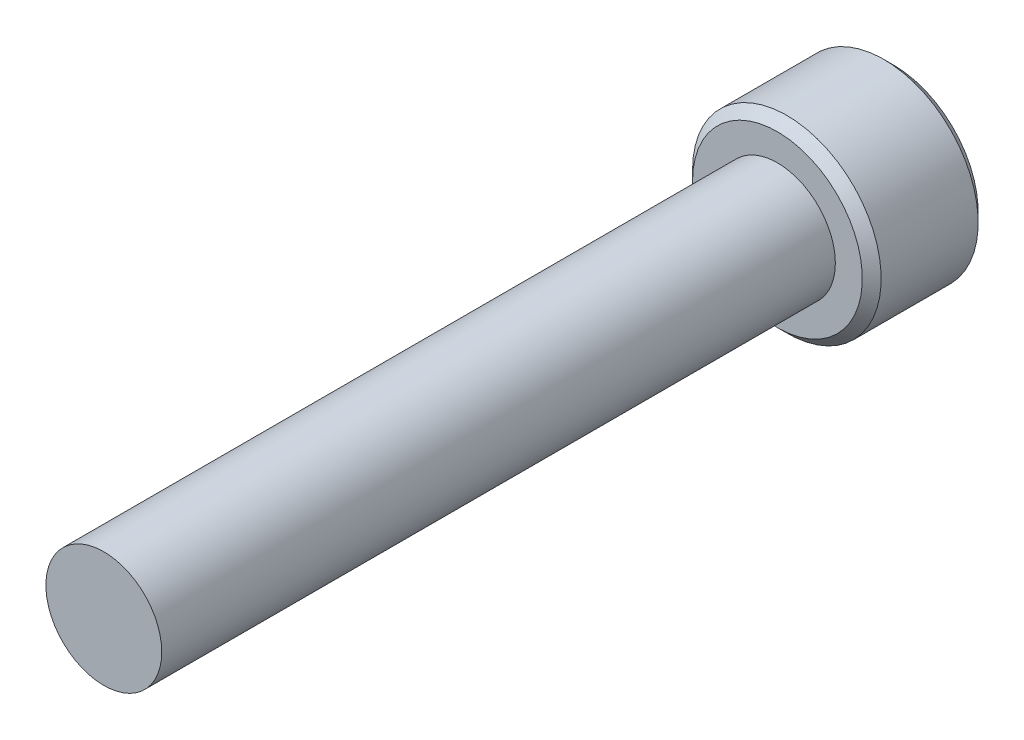
ISO-10303-21;
HEADER;
FILE_DESCRIPTION(('STEP AP214'),'2;1');
FILE_NAME('part.step','',(''),(''),'','','');
FILE_SCHEMA(('AUTOMOTIVE_DESIGN { 1 0 10303 214 1 1 1 1 }'));
ENDSEC;
DATA;
#1=APPLICATION_CONTEXT('core data for automotive mechanical design processes');
#2=APPLICATION_PROTOCOL_DEFINITION('international standard','automotive_design',2000,#1);
#3=PRODUCT_CONTEXT('',#1,'mechanical');
#4=PRODUCT('Part','Part','',(#3));
#5=PRODUCT_RELATED_PRODUCT_CATEGORY('part','',(#4));
#6=PRODUCT_DEFINITION_FORMATION('','',#4);
#7=PRODUCT_DEFINITION_CONTEXT('part definition',#1,'design');
#8=PRODUCT_DEFINITION('design','',#6,#7);
#9=PRODUCT_DEFINITION_SHAPE('','',#8);
#10=(LENGTH_UNIT() NAMED_UNIT(*) SI_UNIT(.MILLI.,.METRE.));
#11=(NAMED_UNIT(*) PLANE_ANGLE_UNIT() SI_UNIT($,.RADIAN.));
#12=(NAMED_UNIT(*) SI_UNIT($,.STERADIAN.) SOLID_ANGLE_UNIT());
#13=UNCERTAINTY_MEASURE_WITH_UNIT(LENGTH_MEASURE(1.E-05),#10,'distance_accuracy_value','');
#14=(GEOMETRIC_REPRESENTATION_CONTEXT(3) GLOBAL_UNCERTAINTY_ASSIGNED_CONTEXT((#13)) GLOBAL_UNIT_ASSIGNED_CONTEXT((#10,
#11,#12)) REPRESENTATION_CONTEXT('',''));
#15=CARTESIAN_POINT('',(0.,0.,0.));
#16=DIRECTION('',(0.,0.,1.));
#17=DIRECTION('',(1.,0.,0.));
#18=AXIS2_PLACEMENT_3D('',#15,#16,#17);
#19=CARTESIAN_POINT('',(0.,0.,-12.7));
#20=DIRECTION('',(0.,0.,1.));
#21=DIRECTION('',(1.,0.,0.));
#22=AXIS2_PLACEMENT_3D('',#19,#20,#21);
#23=CYLINDRICAL_SURFACE('',#22,1.0922);
#24=CARTESIAN_POINT('',(0.,0.,-12.7));
#25=DIRECTION('',(0.,0.,1.));
#26=DIRECTION('',(1.,0.,0.));
#27=AXIS2_PLACEMENT_3D('',#24,#25,#26);
#28=CIRCLE('',#27,1.0922);
#29=CARTESIAN_POINT('',(1.0922,0.,-12.7));
#30=VERTEX_POINT('',#29);
#31=EDGE_CURVE('E108',#30,#30,#28,.T.);
#32=ORIENTED_EDGE('',*,*,#31,.T.);
#33=EDGE_LOOP('',(#32));
#34=FACE_BOUND('',#33,.T.);
#35=CARTESIAN_POINT('',(0.,0.,0.));
#36=DIRECTION('',(0.,0.,1.));
#37=DIRECTION('',(1.,0.,0.));
#38=AXIS2_PLACEMENT_3D('',#35,#36,#37);
#39=CIRCLE('',#38,1.0922);
#40=CARTESIAN_POINT('',(1.0922,0.,0.));
#41=VERTEX_POINT('',#40);
#42=EDGE_CURVE('E132',#41,#41,#39,.T.);
#43=ORIENTED_EDGE('',*,*,#42,.F.);
#44=EDGE_LOOP('',(#43));
#45=FACE_BOUND('',#44,.T.);
#46=ADVANCED_FACE('F34',(#34,#45),#23,.T.);
#47=CARTESIAN_POINT('',(0.,0.,-12.7));
#48=DIRECTION('',(0.,0.,-1.));
#49=DIRECTION('',(-1.,0.,0.));
#50=AXIS2_PLACEMENT_3D('',#47,#48,#49);
#51=PLANE('',#50);
#52=ORIENTED_EDGE('',*,*,#31,.F.);
#53=EDGE_LOOP('',(#52));
#54=FACE_BOUND('',#53,.T.);
#55=CARTESIAN_POINT('',(0.,0.,-12.7));
#56=DIRECTION('',(0.,0.,-1.));
#57=DIRECTION('',(-1.,0.,0.));
#58=AXIS2_PLACEMENT_3D('',#55,#56,#57);
#59=CIRCLE('',#58,1.6002);
#60=CARTESIAN_POINT('',(-1.6002,0.,-12.7));
#61=VERTEX_POINT('',#60);
#62=EDGE_CURVE('E11',#61,#61,#59,.F.);
#63=ORIENTED_EDGE('',*,*,#62,.T.);
#64=EDGE_LOOP('',(#63));
#65=FACE_BOUND('',#64,.T.);
#66=ADVANCED_FACE('F188',(#54,#65),#51,.F.);
#67=CARTESIAN_POINT('',(0.,0.,-14.8844));
#68=DIRECTION('',(0.,0.,1.));
#69=DIRECTION('',(1.,0.,0.));
#70=AXIS2_PLACEMENT_3D('',#67,#68,#69);
#71=CYLINDRICAL_SURFACE('',#70,1.778);
#72=CARTESIAN_POINT('',(0.,0.,-14.7066));
#73=DIRECTION('',(0.,0.,-1.));
#74=DIRECTION('',(-1.,0.,0.));
#75=AXIS2_PLACEMENT_3D('',#72,#73,#74);
#76=CIRCLE('',#75,1.778);
#77=CARTESIAN_POINT('',(-1.778,0.,-14.7066));
#78=VERTEX_POINT('',#77);
#79=EDGE_CURVE('E42',#78,#78,#76,.F.);
#80=ORIENTED_EDGE('',*,*,#79,.T.);
#81=EDGE_LOOP('',(#80));
#82=FACE_BOUND('',#81,.T.);
#83=CARTESIAN_POINT('',(0.,0.,-12.8778));
#84=DIRECTION('',(0.,0.,-1.));
#85=DIRECTION('',(-1.,0.,0.));
#86=AXIS2_PLACEMENT_3D('',#83,#84,#85);
#87=CIRCLE('',#86,1.778);
#88=CARTESIAN_POINT('',(-1.778,0.,-12.8778));
#89=VERTEX_POINT('',#88);
#90=EDGE_CURVE('E169',#89,#89,#87,.T.);
#91=ORIENTED_EDGE('',*,*,#90,.T.);
#92=EDGE_LOOP('',(#91));
#93=FACE_BOUND('',#92,.T.);
#94=ADVANCED_FACE('F174',(#82,#93),#71,.T.);
#95=CARTESIAN_POINT('',(0.,0.,-14.8844));
#96=DIRECTION('',(0.,0.,-1.));
#97=DIRECTION('',(-1.,0.,0.));
#98=AXIS2_PLACEMENT_3D('',#95,#96,#97);
#99=PLANE('',#98);
#100=CARTESIAN_POINT('',(0.,0.,-14.8844));
#101=DIRECTION('',(0.,0.,-1.));
#102=DIRECTION('',(-1.,0.,0.));
#103=AXIS2_PLACEMENT_3D('',#100,#101,#102);
#104=CIRCLE('',#103,1.6002);
#105=CARTESIAN_POINT('',(-1.6002,0.,-14.8844));
#106=VERTEX_POINT('',#105);
#107=EDGE_CURVE('E107',#106,#106,#104,.T.);
#108=ORIENTED_EDGE('',*,*,#107,.T.);
#109=EDGE_LOOP('',(#108));
#110=FACE_BOUND('',#109,.T.);
#111=CARTESIAN_POINT('',(0.,0.,-14.8844));
#112=DIRECTION('',(0.,0.,-1.));
#113=DIRECTION('',(-1.,0.,0.));
#114=AXIS2_PLACEMENT_3D('',#111,#112,#113);
#115=CIRCLE('',#114,1.14567944042316);
#116=CARTESIAN_POINT('',(-0.992187499999999,0.572839720211583,-14.8844));
#117=VERTEX_POINT('',#116);
#118=CARTESIAN_POINT('',(0.,1.14567944042316,-14.8844));
#119=VERTEX_POINT('',#118);
#120=EDGE_CURVE('E88',#117,#119,#115,.T.);
#121=ORIENTED_EDGE('',*,*,#120,.F.);
#122=CARTESIAN_POINT('',(-0.9921875,-0.572839720211582,-14.8844));
#123=VERTEX_POINT('',#122);
#124=EDGE_CURVE('E48',#123,#117,#115,.T.);
#125=ORIENTED_EDGE('',*,*,#124,.F.);
#126=CARTESIAN_POINT('',(0.,-1.14567944042316,-14.8844));
#127=VERTEX_POINT('',#126);
#128=EDGE_CURVE('E210',#127,#123,#115,.T.);
#129=ORIENTED_EDGE('',*,*,#128,.F.);
#130=CARTESIAN_POINT('',(0.9921875,-0.572839720211582,-14.8844));
#131=VERTEX_POINT('',#130);
#132=EDGE_CURVE('E55',#131,#127,#115,.T.);
#133=ORIENTED_EDGE('',*,*,#132,.F.);
#134=CARTESIAN_POINT('',(0.9921875,0.572839720211582,-14.8844));
#135=VERTEX_POINT('',#134);
#136=EDGE_CURVE('E129',#135,#131,#115,.T.);
#137=ORIENTED_EDGE('',*,*,#136,.F.);
#138=EDGE_CURVE('E97',#119,#135,#115,.T.);
#139=ORIENTED_EDGE('',*,*,#138,.F.);
#140=EDGE_LOOP('',(#121,#125,#129,#133,#137,#139));
#141=FACE_BOUND('',#140,.T.);
#142=ADVANCED_FACE('F128',(#110,#141),#99,.T.);
#143=CARTESIAN_POINT('',(0.,0.,-14.8844));
#144=DIRECTION('',(0.,0.,-1.));
#145=DIRECTION('',(-1.,0.,0.));
#146=AXIS2_PLACEMENT_3D('',#143,#144,#145);
#147=CONICAL_SURFACE('',#146,1.14567944042316,0.78539816339745);
#148=ORIENTED_EDGE('',*,*,#138,.T.);
#149=CARTESIAN_POINT('',(-0.000199999999999817,1.145794910477,-14.884515487509));
#150=CARTESIAN_POINT('',(0.0339140752321559,1.12609913995856,-14.8648328114047));
#151=CARTESIAN_POINT('',(0.0685985894922793,1.10607402631377,-14.8463056845184));
#152=CARTESIAN_POINT('',(0.139324581199959,1.06524035596264,-14.8123823296504));
#153=CARTESIAN_POINT('',(0.175372791624242,1.04442791197037,-14.7970049872309));
#154=CARTESIAN_POINT('',(0.248062511737395,1.00246048249572,-14.7706631427343));
#155=CARTESIAN_POINT('',(0.284685489013201,0.981316196707012,-14.7596323965131));
#156=CARTESIAN_POINT('',(0.358737506246056,0.938562244623588,-14.7426362056729));
#157=CARTESIAN_POINT('',(0.396164282559342,0.916953885244213,-14.7366580675789));
#158=CARTESIAN_POINT('',(0.46066463860547,0.879714587318154,-14.7312663449143));
#159=CARTESIAN_POINT('',(0.487654299314528,0.864132099442442,-14.7304689963883));
#160=CARTESIAN_POINT('',(0.541581355945663,0.832997298779853,-14.7318081933614));
#161=CARTESIAN_POINT('',(0.568518739024239,0.817444993408173,-14.733945386137));
#162=CARTESIAN_POINT('',(0.648946222958496,0.771010163908485,-14.744617571306));
#163=CARTESIAN_POINT('',(0.702036069363282,0.740358726795446,-14.7574143807227));
#164=CARTESIAN_POINT('',(0.795214637965797,0.68656205513008,-14.7882974676501));
#165=CARTESIAN_POINT('',(0.835740306309516,0.663164549602745,-14.8047650089077));
#166=CARTESIAN_POINT('',(0.915204315708207,0.617285982385523,-14.8418603835568));
#167=CARTESIAN_POINT('',(0.954147338261523,0.594802217831308,-14.8624746806455));
#168=CARTESIAN_POINT('',(0.9923875,0.572724250157744,-14.884515487509));
#169=B_SPLINE_CURVE_WITH_KNOTS('',3,(#149,#150,#151,#152,#153,#154,#155,#156,#157,#158,#159,
#160,#161,#162,#163,#164,#165,#166,#167,#168),.UNSPECIFIED.,.F.,.F.,(4,2,2,2,2,2,2,2,2,4),(0.,
0.132197185210189,0.265165186853262,0.396020097605669,0.526545281028573,0.619935205043263,
0.713345731536163,0.900220051846368,1.04884529769095,1.1969930355767),.UNSPECIFIED.);
#170=EDGE_CURVE('E102',#119,#135,#169,.T.);
#171=ORIENTED_EDGE('',*,*,#170,.F.);
#172=EDGE_LOOP('',(#148,#171));
#173=FACE_BOUND('',#172,.T.);
#174=ADVANCED_FACE('F103',(#173),#147,.F.);
#175=ORIENTED_EDGE('',*,*,#136,.T.);
#176=CARTESIAN_POINT('',(0.9921875,-1.14247621078911,-15.2518920394083));
#177=CARTESIAN_POINT('',(0.9921875,-1.11465764801141,-15.2308916392497));
#178=CARTESIAN_POINT('',(0.9921875,-1.08668408094051,-15.2100971477058));
#179=CARTESIAN_POINT('',(0.9921875,-1.03036405365904,-15.1690050376869));
#180=CARTESIAN_POINT('',(0.9921875,-1.00201750223733,-15.1487075443571));
#181=CARTESIAN_POINT('',(0.9921875,-0.915909012346496,-15.0883985074939));
#182=CARTESIAN_POINT('',(0.9921875,-0.857501195839066,-15.0492938521726));
#183=CARTESIAN_POINT('',(0.9921875,-0.735022281240404,-14.9725267527611));
#184=CARTESIAN_POINT('',(0.9921875,-0.670818221894543,-14.9350740309963));
#185=CARTESIAN_POINT('',(0.9921875,-0.539203244212803,-14.866565020461));
#186=CARTESIAN_POINT('',(0.9921875,-0.471804118965062,-14.8354871682543));
#187=CARTESIAN_POINT('',(0.9921875,-0.370637445252798,-14.7974662962363));
#188=CARTESIAN_POINT('',(0.9921875,-0.338367677251603,-14.7865540323325));
#189=CARTESIAN_POINT('',(0.9921875,-0.273049086247197,-14.7673202300993));
#190=CARTESIAN_POINT('',(0.9921875,-0.240000209742886,-14.7589988702472));
#191=CARTESIAN_POINT('',(0.9921875,-0.173878395816095,-14.7455187736821));
#192=CARTESIAN_POINT('',(0.9921875,-0.140816774716471,-14.7403053939651));
#193=CARTESIAN_POINT('',(0.9921875,-0.0743291671992152,-14.7331397124571));
#194=CARTESIAN_POINT('',(0.9921875,-0.0409031259919585,-14.7311879080354));
#195=CARTESIAN_POINT('',(0.9921875,0.0247631141129242,-14.7306934859057));
#196=CARTESIAN_POINT('',(0.9921875,0.0570024445003658,-14.7320300314208));
#197=CARTESIAN_POINT('',(0.9921875,0.12119422050107,-14.7377710432138));
#198=CARTESIAN_POINT('',(0.9921875,0.153146730366262,-14.7421748040939));
#199=CARTESIAN_POINT('',(0.9921875,0.217090524657735,-14.7538845111597));
#200=CARTESIAN_POINT('',(0.9921875,0.249072542149664,-14.7612403024366));
#201=CARTESIAN_POINT('',(0.9921875,0.312337779758395,-14.7784630913854));
#202=CARTESIAN_POINT('',(0.9921875,0.343621058108105,-14.788329878935));
#203=CARTESIAN_POINT('',(0.9921875,0.442112983138562,-14.8231061115969));
#204=CARTESIAN_POINT('',(0.9921875,0.507919771198878,-14.8519761641508));
#205=CARTESIAN_POINT('',(0.9921875,0.636441891183642,-14.9161652099233));
#206=CARTESIAN_POINT('',(0.9921875,0.699145053961292,-14.9515073722097));
#207=CARTESIAN_POINT('',(0.9921875,0.818979830095492,-15.0244213708677));
#208=CARTESIAN_POINT('',(0.9921875,0.876233471712466,-15.0617951350485));
#209=CARTESIAN_POINT('',(0.9921875,0.960585190784996,-15.1195711119045));
#210=CARTESIAN_POINT('',(0.9921875,0.988338378424187,-15.139033487671));
#211=CARTESIAN_POINT('',(0.9921875,1.04346551341386,-15.1784729817717));
#212=CARTESIAN_POINT('',(0.9921875,1.07083956239906,-15.1984499578848));
#213=CARTESIAN_POINT('',(0.9921875,1.09805574523311,-15.2186403056427));
#214=B_SPLINE_CURVE_WITH_KNOTS('',3,(#176,#177,#178,#179,#180,#181,#182,#183,#184,#185,#186,
#187,#188,#189,#190,#191,#192,#193,#194,#195,#196,#197,#198,#199,#200,#201,#202,#203,#204,#205,
#206,#207,#208,#209,#210,#211,#212,#213),.UNSPECIFIED.,.F.,.F.,(4,2,2,2,2,2,2,2,2,2,2,2,2,2,2,2,
2,2,4),(0.,0.104563127371703,0.209152318679108,0.419927098975113,0.642732653870156,
0.864771652131277,0.966879847039378,1.06899507422301,1.16925752982867,1.26953527342201,
1.36618351686957,1.46280954049584,1.56114078094885,1.65946379566813,1.87441437168727,
2.09015003608822,2.29516517576016,2.39685303378669,2.49851308339968),.UNSPECIFIED.);
#215=EDGE_CURVE('E96',#135,#131,#214,.F.);
#216=ORIENTED_EDGE('',*,*,#215,.F.);
#217=EDGE_LOOP('',(#175,#216));
#218=FACE_BOUND('',#217,.T.);
#219=ADVANCED_FACE('F187',(#218),#147,.F.);
#220=ORIENTED_EDGE('',*,*,#132,.T.);
#221=CARTESIAN_POINT('',(0.9923875,-0.572724250157744,-14.884515487509));
#222=CARTESIAN_POINT('',(0.958273424767844,-0.592420020676184,-14.8648328114047));
#223=CARTESIAN_POINT('',(0.923588910507721,-0.612445134320978,-14.8463056845184));
#224=CARTESIAN_POINT('',(0.852862918800041,-0.65327880467211,-14.8123823296504));
#225=CARTESIAN_POINT('',(0.816814708375758,-0.674091248664374,-14.7970049872309));
#226=CARTESIAN_POINT('',(0.744124988262605,-0.716058678139022,-14.7706631427343));
#227=CARTESIAN_POINT('',(0.707502010986799,-0.737202963927733,-14.7596323965131));
#228=CARTESIAN_POINT('',(0.633449993753944,-0.779956916011157,-14.7426362056729));
#229=CARTESIAN_POINT('',(0.596023217440658,-0.801565275390533,-14.7366580675789));
#230=CARTESIAN_POINT('',(0.53152286139453,-0.838804573316592,-14.7312663449143));
#231=CARTESIAN_POINT('',(0.504533200685471,-0.854387061192303,-14.7304689963883));
#232=CARTESIAN_POINT('',(0.450606144054337,-0.885521861854893,-14.7318081933614));
#233=CARTESIAN_POINT('',(0.423668760975761,-0.901074167226573,-14.733945386137));
#234=CARTESIAN_POINT('',(0.343241277041503,-0.947508996726261,-14.744617571306));
#235=CARTESIAN_POINT('',(0.290151430636718,-0.978160433839299,-14.7574143807227));
#236=CARTESIAN_POINT('',(0.196972862034203,-1.03195710550467,-14.7882974676501));
#237=CARTESIAN_POINT('',(0.156447193690484,-1.055354611032,-14.8047650089077));
#238=CARTESIAN_POINT('',(0.0769831842917928,-1.10123317824922,-14.8418603835568));
#239=CARTESIAN_POINT('',(0.0380401617384762,-1.12371694280344,-14.8624746806455));
#240=CARTESIAN_POINT('',(-0.00020000000000065,-1.145794910477,-14.884515487509));
#241=B_SPLINE_CURVE_WITH_KNOTS('',3,(#221,#222,#223,#224,#225,#226,#227,#228,#229,#230,#231,
#232,#233,#234,#235,#236,#237,#238,#239,#240),.UNSPECIFIED.,.F.,.F.,(4,2,2,2,2,2,2,2,2,4),(0.,
0.132197185210189,0.265165186853262,0.396020097605669,0.526545281028573,0.619935205043263,
0.713345731536163,0.900220051846368,1.04884529769095,1.1969930355767),.UNSPECIFIED.);
#242=EDGE_CURVE('E140',#131,#127,#241,.T.);
#243=ORIENTED_EDGE('',*,*,#242,.F.);
#244=EDGE_LOOP('',(#220,#243));
#245=FACE_BOUND('',#244,.T.);
#246=ADVANCED_FACE('F307',(#245),#147,.F.);
#247=ORIENTED_EDGE('',*,*,#128,.T.);
#248=CARTESIAN_POINT('',(0.000200000000000218,-1.145794910477,-14.884515487509));
#249=CARTESIAN_POINT('',(-0.0339140752321555,-1.12609913995856,-14.8648328114047));
#250=CARTESIAN_POINT('',(-0.0685985894922791,-1.10607402631377,-14.8463056845184));
#251=CARTESIAN_POINT('',(-0.139324581199958,-1.06524035596264,-14.8123823296504));
#252=CARTESIAN_POINT('',(-0.175372791624242,-1.04442791197037,-14.7970049872309));
#253=CARTESIAN_POINT('',(-0.248062511737395,-1.00246048249572,-14.7706631427343));
#254=CARTESIAN_POINT('',(-0.2846854890132,-0.981316196707012,-14.7596323965131));
#255=CARTESIAN_POINT('',(-0.358737506246055,-0.938562244623589,-14.7426362056729));
#256=CARTESIAN_POINT('',(-0.396164282559341,-0.916953885244213,-14.7366580675789));
#257=CARTESIAN_POINT('',(-0.460664638605469,-0.879714587318154,-14.7312663449143));
#258=CARTESIAN_POINT('',(-0.487654299314528,-0.864132099442442,-14.7304689963883));
#259=CARTESIAN_POINT('',(-0.541581355945663,-0.832997298779853,-14.7318081933614));
#260=CARTESIAN_POINT('',(-0.568518739024238,-0.817444993408173,-14.733945386137));
#261=CARTESIAN_POINT('',(-0.648946222958496,-0.771010163908485,-14.744617571306));
#262=CARTESIAN_POINT('',(-0.702036069363281,-0.740358726795446,-14.7574143807227));
#263=CARTESIAN_POINT('',(-0.795214637965796,-0.68656205513008,-14.7882974676501));
#264=CARTESIAN_POINT('',(-0.835740306309515,-0.663164549602745,-14.8047650089077));
#265=CARTESIAN_POINT('',(-0.915204315708206,-0.617285982385523,-14.8418603835568));
#266=CARTESIAN_POINT('',(-0.954147338261523,-0.594802217831308,-14.8624746806455));
#267=CARTESIAN_POINT('',(-0.9923875,-0.572724250157744,-14.884515487509));
#268=B_SPLINE_CURVE_WITH_KNOTS('',3,(#248,#249,#250,#251,#252,#253,#254,#255,#256,#257,#258,
#259,#260,#261,#262,#263,#264,#265,#266,#267),.UNSPECIFIED.,.F.,.F.,(4,2,2,2,2,2,2,2,2,4),(0.,
0.13219718521019,0.265165186853262,0.396020097605669,0.526545281028573,0.619935205043264,
0.713345731536163,0.900220051846368,1.04884529769095,1.1969930355767),.UNSPECIFIED.);
#269=EDGE_CURVE('E216',#127,#123,#268,.T.);
#270=ORIENTED_EDGE('',*,*,#269,.F.);
#271=EDGE_LOOP('',(#247,#270));
#272=FACE_BOUND('',#271,.T.);
#273=ADVANCED_FACE('F214',(#272),#147,.F.);
#274=ORIENTED_EDGE('',*,*,#124,.T.);
#275=CARTESIAN_POINT('',(-0.9921875,-1.14247621095534,-15.2518920395338));
#276=CARTESIAN_POINT('',(-0.9921875,-1.11465764817297,-15.2308916393704));
#277=CARTESIAN_POINT('',(-0.9921875,-1.08668408109739,-15.2100971478216));
#278=CARTESIAN_POINT('',(-0.9921875,-1.03036405380652,-15.1690050377931));
#279=CARTESIAN_POINT('',(-0.9921875,-1.00201750238008,-15.1487075444585));
#280=CARTESIAN_POINT('',(-0.9921875,-0.915909012474785,-15.0883985075809));
#281=CARTESIAN_POINT('',(-0.9921875,-0.857501195957519,-15.04929385225));
#282=CARTESIAN_POINT('',(-0.9921875,-0.735022281337406,-14.9725267528187));
#283=CARTESIAN_POINT('',(-0.9921875,-0.670818221979873,-14.9350740310437));
#284=CARTESIAN_POINT('',(-0.9921875,-0.539203244273796,-14.8665650204898));
#285=CARTESIAN_POINT('',(-0.9921875,-0.471804119013398,-14.8354871682744));
#286=CARTESIAN_POINT('',(-0.9921875,-0.370637445291612,-14.79746629625));
#287=CARTESIAN_POINT('',(-0.9921875,-0.338367677294405,-14.7865540323464));
#288=CARTESIAN_POINT('',(-0.9921875,-0.273049086298105,-14.767320230113));
#289=CARTESIAN_POINT('',(-0.9921875,-0.240000209797913,-14.7589988702603));
#290=CARTESIAN_POINT('',(-0.9921875,-0.17387839587922,-14.7455187736932));
#291=CARTESIAN_POINT('',(-0.9921875,-0.140816774783575,-14.7403053939747));
#292=CARTESIAN_POINT('',(-0.9921875,-0.0743291672741469,-14.7331397124628));
#293=CARTESIAN_POINT('',(-0.9921875,-0.0409031260707386,-14.7311879080388));
#294=CARTESIAN_POINT('',(-0.9921875,0.0247631140270444,-14.7306934859037));
#295=CARTESIAN_POINT('',(-0.9921875,0.0570024444112249,-14.7320300314157));
#296=CARTESIAN_POINT('',(-0.9921875,0.121194220405733,-14.7377710432024));
#297=CARTESIAN_POINT('',(-0.9921875,0.15314673026799,-14.7421748040789));
#298=CARTESIAN_POINT('',(-0.9921875,0.21709052455367,-14.7538845111375));
#299=CARTESIAN_POINT('',(-0.9921875,0.249072542042748,-14.7612403024107));
#300=CARTESIAN_POINT('',(-0.9921875,0.312337779646054,-14.7784630913517));
#301=CARTESIAN_POINT('',(-0.9921875,0.343621057993189,-14.7883298788974));
#302=CARTESIAN_POINT('',(-0.9921875,0.442112982998623,-14.8231061115409));
#303=CARTESIAN_POINT('',(-0.9921875,0.507919771037746,-14.851976164078));
#304=CARTESIAN_POINT('',(-0.9921875,0.63644189098175,-14.9161652098148));
#305=CARTESIAN_POINT('',(-0.9921875,0.699145053739844,-14.9515073720824));
#306=CARTESIAN_POINT('',(-0.9921875,0.818979829838883,-15.0244213707045));
#307=CARTESIAN_POINT('',(-0.9921875,0.876233471440128,-15.0617951348683));
#308=CARTESIAN_POINT('',(-0.9921875,0.9605851904894,-15.1195711116989));
#309=CARTESIAN_POINT('',(-0.9921875,0.98833837812095,-15.139033487457));
#310=CARTESIAN_POINT('',(-0.9921875,1.0434655130954,-15.1784729815409));
#311=CARTESIAN_POINT('',(-0.9921875,1.070839562073,-15.1984499576456));
#312=CARTESIAN_POINT('',(-0.9921875,1.09805574489947,-15.2186403053952));
#313=B_SPLINE_CURVE_WITH_KNOTS('',3,(#275,#276,#277,#278,#279,#280,#281,#282,#283,#284,#285,
#286,#287,#288,#289,#290,#291,#292,#293,#294,#295,#296,#297,#298,#299,#300,#301,#302,#303,#304,
#305,#306,#307,#308,#309,#310,#311,#312),.UNSPECIFIED.,.F.,.F.,(4,2,2,2,2,2,2,2,2,2,2,2,2,2,2,2,
2,2,4),(0.,0.104563127391605,0.209152318718919,0.419927099055485,0.642732653996012,
0.864771652302187,0.966879847198757,1.06899507437088,1.1692575299655,1.2695352735478,
1.36618351698525,1.4628095406014,1.56114078104352,1.65946379575192,1.87441437169281,
2.090150036015,2.29516517561956,2.39685303361285,2.4985130831926),.UNSPECIFIED.);
#314=EDGE_CURVE('E118',#123,#117,#313,.T.);
#315=ORIENTED_EDGE('',*,*,#314,.F.);
#316=EDGE_LOOP('',(#274,#315));
#317=FACE_BOUND('',#316,.T.);
#318=ADVANCED_FACE('F296',(#317),#147,.F.);
#319=ORIENTED_EDGE('',*,*,#120,.T.);
#320=CARTESIAN_POINT('',(-0.992387499999999,0.572724250157744,-14.884515487509));
#321=CARTESIAN_POINT('',(-0.958273424767843,0.592420020676185,-14.8648328114047));
#322=CARTESIAN_POINT('',(-0.923588910507719,0.612445134320979,-14.8463056845184));
#323=CARTESIAN_POINT('',(-0.852862918800039,0.653278804672111,-14.8123823296504));
#324=CARTESIAN_POINT('',(-0.816814708375756,0.674091248664375,-14.7970049872309));
#325=CARTESIAN_POINT('',(-0.744124988262603,0.716058678139022,-14.7706631427343));
#326=CARTESIAN_POINT('',(-0.707502010986798,0.737202963927734,-14.7596323965131));
#327=CARTESIAN_POINT('',(-0.633449993753943,0.779956916011158,-14.7426362056729));
#328=CARTESIAN_POINT('',(-0.596023217440656,0.801565275390533,-14.7366580675789));
#329=CARTESIAN_POINT('',(-0.531522861394528,0.838804573316592,-14.7312663449143));
#330=CARTESIAN_POINT('',(-0.50453320068547,0.854387061192304,-14.7304689963883));
#331=CARTESIAN_POINT('',(-0.450606144054335,0.885521861854894,-14.7318081933614));
#332=CARTESIAN_POINT('',(-0.42366876097576,0.901074167226573,-14.733945386137));
#333=CARTESIAN_POINT('',(-0.343241277041502,0.947508996726261,-14.744617571306));
#334=CARTESIAN_POINT('',(-0.290151430636717,0.9781604338393,-14.7574143807227));
#335=CARTESIAN_POINT('',(-0.196972862034202,1.03195710550467,-14.7882974676501));
#336=CARTESIAN_POINT('',(-0.156447193690483,1.055354611032,-14.8047650089077));
#337=CARTESIAN_POINT('',(-0.0769831842917928,1.10123317824922,-14.8418603835568));
#338=CARTESIAN_POINT('',(-0.0380401617384767,1.12371694280344,-14.8624746806455));
#339=CARTESIAN_POINT('',(0.000199999999999844,1.145794910477,-14.884515487509));
#340=B_SPLINE_CURVE_WITH_KNOTS('',3,(#320,#321,#322,#323,#324,#325,#326,#327,#328,#329,#330,
#331,#332,#333,#334,#335,#336,#337,#338,#339),.UNSPECIFIED.,.F.,.F.,(4,2,2,2,2,2,2,2,2,4),(0.,
0.132197185210191,0.265165186853263,0.396020097605669,0.526545281028574,0.619935205043264,
0.713345731536164,0.900220051846369,1.04884529769095,1.19699303557669),.UNSPECIFIED.);
#341=EDGE_CURVE('E92',#117,#119,#340,.T.);
#342=ORIENTED_EDGE('',*,*,#341,.F.);
#343=EDGE_LOOP('',(#319,#342));
#344=FACE_BOUND('',#343,.T.);
#345=ADVANCED_FACE('F90',(#344),#147,.F.);
#346=CARTESIAN_POINT('',(0.9921875,1.71851916063474,-13.39611875));
#347=DIRECTION('',(0.,0.,-1.));
#348=DIRECTION('',(-1.,0.,0.));
#349=AXIS2_PLACEMENT_3D('',#346,#347,#348);
#350=PLANE('',#349);
#351=DIRECTION('',(0.866025403784439,0.5,0.));
#352=VECTOR('',#351,1.);
#353=CARTESIAN_POINT('',(-0.9921875,0.572839720211582,-13.39611875));
#354=LINE('',#353,#352);
#355=CARTESIAN_POINT('',(-0.9921875,0.572839720211582,-13.39611875));
#356=VERTEX_POINT('',#355);
#357=CARTESIAN_POINT('',(0.,1.14567944042316,-13.39611875));
#358=VERTEX_POINT('',#357);
#359=EDGE_CURVE('E117',#356,#358,#354,.T.);
#360=ORIENTED_EDGE('',*,*,#359,.T.);
#361=DIRECTION('',(0.866025403784439,-0.5,0.));
#362=VECTOR('',#361,1.);
#363=CARTESIAN_POINT('',(0.,1.14567944042316,-13.39611875));
#364=LINE('',#363,#362);
#365=CARTESIAN_POINT('',(0.9921875,0.572839720211582,-13.39611875));
#366=VERTEX_POINT('',#365);
#367=EDGE_CURVE('E122',#358,#366,#364,.T.);
#368=ORIENTED_EDGE('',*,*,#367,.T.);
#369=DIRECTION('',(0.,-1.,0.));
#370=VECTOR('',#369,1.);
#371=CARTESIAN_POINT('',(0.9921875,0.572839720211582,-13.39611875));
#372=LINE('',#371,#370);
#373=CARTESIAN_POINT('',(0.9921875,-0.572839720211582,-13.39611875));
#374=VERTEX_POINT('',#373);
#375=EDGE_CURVE('E238',#366,#374,#372,.T.);
#376=ORIENTED_EDGE('',*,*,#375,.T.);
#377=DIRECTION('',(-0.866025403784439,-0.5,0.));
#378=VECTOR('',#377,1.);
#379=CARTESIAN_POINT('',(0.9921875,-0.572839720211582,-13.39611875));
#380=LINE('',#379,#378);
#381=CARTESIAN_POINT('',(0.,-1.14567944042316,-13.39611875));
#382=VERTEX_POINT('',#381);
#383=EDGE_CURVE('E240',#374,#382,#380,.T.);
#384=ORIENTED_EDGE('',*,*,#383,.T.);
#385=DIRECTION('',(-0.866025403784439,0.5,0.));
#386=VECTOR('',#385,1.);
#387=CARTESIAN_POINT('',(0.,-1.14567944042316,-13.39611875));
#388=LINE('',#387,#386);
#389=CARTESIAN_POINT('',(-0.9921875,-0.572839720211582,-13.39611875));
#390=VERTEX_POINT('',#389);
#391=EDGE_CURVE('E228',#382,#390,#388,.T.);
#392=ORIENTED_EDGE('',*,*,#391,.T.);
#393=DIRECTION('',(0.,1.,0.));
#394=VECTOR('',#393,1.);
#395=CARTESIAN_POINT('',(-0.9921875,-0.572839720211582,-13.39611875));
#396=LINE('',#395,#394);
#397=EDGE_CURVE('E125',#390,#356,#396,.T.);
#398=ORIENTED_EDGE('',*,*,#397,.T.);
#399=EDGE_LOOP('',(#360,#368,#376,#384,#392,#398));
#400=FACE_BOUND('',#399,.T.);
#401=ADVANCED_FACE('F159',(#400),#350,.T.);
#402=CARTESIAN_POINT('',(0.,1.14567944042316,-13.39611875));
#403=DIRECTION('',(0.5,0.866025403784439,0.));
#404=DIRECTION('',(-0.866025403784439,0.5,0.));
#405=AXIS2_PLACEMENT_3D('',#402,#403,#404);
#406=PLANE('',#405);
#407=DIRECTION('',(0.,0.,-1.));
#408=VECTOR('',#407,1.);
#409=CARTESIAN_POINT('',(0.,1.14567944042316,-13.39611875));
#410=LINE('',#409,#408);
#411=EDGE_CURVE('E114',#358,#119,#410,.T.);
#412=ORIENTED_EDGE('',*,*,#411,.T.);
#413=ORIENTED_EDGE('',*,*,#170,.T.);
#414=DIRECTION('',(0.,0.,-1.));
#415=VECTOR('',#414,1.);
#416=CARTESIAN_POINT('',(0.9921875,0.572839720211582,-13.39611875));
#417=LINE('',#416,#415);
#418=EDGE_CURVE('E124',#366,#135,#417,.T.);
#419=ORIENTED_EDGE('',*,*,#418,.F.);
#420=ORIENTED_EDGE('',*,*,#367,.F.);
#421=EDGE_LOOP('',(#412,#413,#419,#420));
#422=FACE_BOUND('',#421,.T.);
#423=ADVANCED_FACE('F120',(#422),#406,.F.);
#424=CARTESIAN_POINT('',(0.9921875,0.572839720211582,-13.39611875));
#425=DIRECTION('',(1.,0.,0.));
#426=DIRECTION('',(0.,0.,-1.));
#427=AXIS2_PLACEMENT_3D('',#424,#425,#426);
#428=PLANE('',#427);
#429=ORIENTED_EDGE('',*,*,#418,.T.);
#430=ORIENTED_EDGE('',*,*,#215,.T.);
#431=DIRECTION('',(0.,0.,-1.));
#432=VECTOR('',#431,1.);
#433=CARTESIAN_POINT('',(0.9921875,-0.572839720211582,-13.39611875));
#434=LINE('',#433,#432);
#435=EDGE_CURVE('E225',#374,#131,#434,.T.);
#436=ORIENTED_EDGE('',*,*,#435,.F.);
#437=ORIENTED_EDGE('',*,*,#375,.F.);
#438=EDGE_LOOP('',(#429,#430,#436,#437));
#439=FACE_BOUND('',#438,.T.);
#440=ADVANCED_FACE('F148',(#439),#428,.F.);
#441=CARTESIAN_POINT('',(0.9921875,-0.572839720211582,-13.39611875));
#442=DIRECTION('',(0.5,-0.866025403784439,0.));
#443=DIRECTION('',(0.866025403784439,0.5,0.));
#444=AXIS2_PLACEMENT_3D('',#441,#442,#443);
#445=PLANE('',#444);
#446=ORIENTED_EDGE('',*,*,#435,.T.);
#447=ORIENTED_EDGE('',*,*,#242,.T.);
#448=DIRECTION('',(0.,0.,-1.));
#449=VECTOR('',#448,1.);
#450=CARTESIAN_POINT('',(0.,-1.14567944042316,-13.39611875));
#451=LINE('',#450,#449);
#452=EDGE_CURVE('E223',#382,#127,#451,.T.);
#453=ORIENTED_EDGE('',*,*,#452,.F.);
#454=ORIENTED_EDGE('',*,*,#383,.F.);
#455=EDGE_LOOP('',(#446,#447,#453,#454));
#456=FACE_BOUND('',#455,.T.);
#457=ADVANCED_FACE('F152',(#456),#445,.F.);
#458=CARTESIAN_POINT('',(0.,-1.14567944042316,-13.39611875));
#459=DIRECTION('',(-0.5,-0.866025403784439,0.));
#460=DIRECTION('',(0.866025403784439,-0.5,0.));
#461=AXIS2_PLACEMENT_3D('',#458,#459,#460);
#462=PLANE('',#461);
#463=ORIENTED_EDGE('',*,*,#452,.T.);
#464=ORIENTED_EDGE('',*,*,#269,.T.);
#465=DIRECTION('',(0.,0.,-1.));
#466=VECTOR('',#465,1.);
#467=CARTESIAN_POINT('',(-0.9921875,-0.572839720211582,-13.39611875));
#468=LINE('',#467,#466);
#469=EDGE_CURVE('E230',#390,#123,#468,.T.);
#470=ORIENTED_EDGE('',*,*,#469,.F.);
#471=ORIENTED_EDGE('',*,*,#391,.F.);
#472=EDGE_LOOP('',(#463,#464,#470,#471));
#473=FACE_BOUND('',#472,.T.);
#474=ADVANCED_FACE('F226',(#473),#462,.F.);
#475=CARTESIAN_POINT('',(-0.9921875,-0.572839720211582,-13.39611875));
#476=DIRECTION('',(-1.,0.,0.));
#477=DIRECTION('',(0.,-1.,0.));
#478=AXIS2_PLACEMENT_3D('',#475,#476,#477);
#479=PLANE('',#478);
#480=ORIENTED_EDGE('',*,*,#469,.T.);
#481=ORIENTED_EDGE('',*,*,#314,.T.);
#482=DIRECTION('',(0.,0.,-1.));
#483=VECTOR('',#482,1.);
#484=CARTESIAN_POINT('',(-0.9921875,0.572839720211582,-13.39611875));
#485=LINE('',#484,#483);
#486=EDGE_CURVE('E116',#356,#117,#485,.T.);
#487=ORIENTED_EDGE('',*,*,#486,.F.);
#488=ORIENTED_EDGE('',*,*,#397,.F.);
#489=EDGE_LOOP('',(#480,#481,#487,#488));
#490=FACE_BOUND('',#489,.T.);
#491=ADVANCED_FACE('F255',(#490),#479,.F.);
#492=CARTESIAN_POINT('',(-0.9921875,0.572839720211582,-13.39611875));
#493=DIRECTION('',(-0.5,0.866025403784439,0.));
#494=DIRECTION('',(-0.866025403784439,-0.5,0.));
#495=AXIS2_PLACEMENT_3D('',#492,#493,#494);
#496=PLANE('',#495);
#497=ORIENTED_EDGE('',*,*,#486,.T.);
#498=ORIENTED_EDGE('',*,*,#341,.T.);
#499=ORIENTED_EDGE('',*,*,#411,.F.);
#500=ORIENTED_EDGE('',*,*,#359,.F.);
#501=EDGE_LOOP('',(#497,#498,#499,#500));
#502=FACE_BOUND('',#501,.T.);
#503=ADVANCED_FACE('F112',(#502),#496,.F.);
#504=CARTESIAN_POINT('',(0.,0.,-14.8844));
#505=DIRECTION('',(0.,0.,1.));
#506=DIRECTION('',(1.,0.,0.));
#507=AXIS2_PLACEMENT_3D('',#504,#505,#506);
#508=CONICAL_SURFACE('',#507,1.6002,0.785398163397448);
#509=ORIENTED_EDGE('',*,*,#79,.F.);
#510=EDGE_LOOP('',(#509));
#511=FACE_BOUND('',#510,.T.);
#512=ORIENTED_EDGE('',*,*,#107,.F.);
#513=EDGE_LOOP('',(#512));
#514=FACE_BOUND('',#513,.T.);
#515=ADVANCED_FACE('F177',(#511,#514),#508,.T.);
#516=CARTESIAN_POINT('',(0.,0.,-12.8778));
#517=DIRECTION('',(0.,0.,-1.));
#518=DIRECTION('',(-1.,0.,0.));
#519=AXIS2_PLACEMENT_3D('',#516,#517,#518);
#520=CONICAL_SURFACE('',#519,1.778,0.785398163397444);
#521=CARTESIAN_POINT('',(-1.6002,0.,-12.7));
#522=CARTESIAN_POINT('',(-1.60205208333333,0.,-12.7018520833333));
#523=CARTESIAN_POINT('',(-1.60390416666667,0.,-12.7037041666667));
#524=CARTESIAN_POINT('',(-1.60760833333333,0.,-12.7074083333333));
#525=CARTESIAN_POINT('',(-1.60946041666667,0.,-12.7092604166667));
#526=CARTESIAN_POINT('',(-1.61316458333333,0.,-12.7129645833333));
#527=CARTESIAN_POINT('',(-1.61501666666666,0.,-12.7148166666667));
#528=CARTESIAN_POINT('',(-1.61872083333333,0.,-12.7185208333333));
#529=CARTESIAN_POINT('',(-1.62057291666667,0.,-12.7203729166667));
#530=CARTESIAN_POINT('',(-1.62427708333333,0.,-12.7240770833333));
#531=CARTESIAN_POINT('',(-1.62612916666667,0.,-12.7259291666667));
#532=CARTESIAN_POINT('',(-1.62983333333333,0.,-12.7296333333333));
#533=CARTESIAN_POINT('',(-1.63168541666667,0.,-12.7314854166667));
#534=CARTESIAN_POINT('',(-1.63538958333333,0.,-12.7351895833333));
#535=CARTESIAN_POINT('',(-1.63724166666667,0.,-12.7370416666667));
#536=CARTESIAN_POINT('',(-1.64094583333333,0.,-12.7407458333333));
#537=CARTESIAN_POINT('',(-1.64279791666667,0.,-12.7425979166667));
#538=CARTESIAN_POINT('',(-1.64650208333333,0.,-12.7463020833333));
#539=CARTESIAN_POINT('',(-1.64835416666667,0.,-12.7481541666667));
#540=CARTESIAN_POINT('',(-1.65205833333333,0.,-12.7518583333333));
#541=CARTESIAN_POINT('',(-1.65391041666667,0.,-12.7537104166667));
#542=CARTESIAN_POINT('',(-1.65761458333333,0.,-12.7574145833333));
#543=CARTESIAN_POINT('',(-1.65946666666667,0.,-12.7592666666667));
#544=CARTESIAN_POINT('',(-1.66317083333333,0.,-12.7629708333333));
#545=CARTESIAN_POINT('',(-1.66502291666667,0.,-12.7648229166667));
#546=CARTESIAN_POINT('',(-1.66872708333333,0.,-12.7685270833333));
#547=CARTESIAN_POINT('',(-1.67057916666667,0.,-12.7703791666667));
#548=CARTESIAN_POINT('',(-1.67428333333333,0.,-12.7740833333333));
#549=CARTESIAN_POINT('',(-1.67613541666667,0.,-12.7759354166667));
#550=CARTESIAN_POINT('',(-1.67983958333333,0.,-12.7796395833333));
#551=CARTESIAN_POINT('',(-1.68169166666667,0.,-12.7814916666667));
#552=CARTESIAN_POINT('',(-1.68539583333333,0.,-12.7851958333333));
#553=CARTESIAN_POINT('',(-1.68724791666667,0.,-12.7870479166667));
#554=CARTESIAN_POINT('',(-1.69095208333333,0.,-12.7907520833333));
#555=CARTESIAN_POINT('',(-1.69280416666667,0.,-12.7926041666667));
#556=CARTESIAN_POINT('',(-1.69650833333333,0.,-12.7963083333333));
#557=CARTESIAN_POINT('',(-1.69836041666667,0.,-12.7981604166667));
#558=CARTESIAN_POINT('',(-1.70206458333333,0.,-12.8018645833333));
#559=CARTESIAN_POINT('',(-1.70391666666667,0.,-12.8037166666667));
#560=CARTESIAN_POINT('',(-1.70762083333333,0.,-12.8074208333333));
#561=CARTESIAN_POINT('',(-1.70947291666667,0.,-12.8092729166667));
#562=CARTESIAN_POINT('',(-1.71317708333333,0.,-12.8129770833333));
#563=CARTESIAN_POINT('',(-1.71502916666667,0.,-12.8148291666667));
#564=CARTESIAN_POINT('',(-1.71873333333333,0.,-12.8185333333333));
#565=CARTESIAN_POINT('',(-1.72058541666667,0.,-12.8203854166667));
#566=CARTESIAN_POINT('',(-1.72428958333333,0.,-12.8240895833333));
#567=CARTESIAN_POINT('',(-1.72614166666667,0.,-12.8259416666667));
#568=CARTESIAN_POINT('',(-1.72984583333333,0.,-12.8296458333333));
#569=CARTESIAN_POINT('',(-1.73169791666667,0.,-12.8314979166667));
#570=CARTESIAN_POINT('',(-1.73540208333333,0.,-12.8352020833333));
#571=CARTESIAN_POINT('',(-1.73725416666667,0.,-12.8370541666667));
#572=CARTESIAN_POINT('',(-1.74095833333333,0.,-12.8407583333333));
#573=CARTESIAN_POINT('',(-1.74281041666667,0.,-12.8426104166667));
#574=CARTESIAN_POINT('',(-1.74651458333333,0.,-12.8463145833333));
#575=CARTESIAN_POINT('',(-1.74836666666667,0.,-12.8481666666667));
#576=CARTESIAN_POINT('',(-1.75207083333333,0.,-12.8518708333333));
#577=CARTESIAN_POINT('',(-1.75392291666667,0.,-12.8537229166667));
#578=CARTESIAN_POINT('',(-1.75762708333333,0.,-12.8574270833333));
#579=CARTESIAN_POINT('',(-1.75947916666667,0.,-12.8592791666667));
#580=CARTESIAN_POINT('',(-1.76318333333333,0.,-12.8629833333333));
#581=CARTESIAN_POINT('',(-1.76503541666667,0.,-12.8648354166667));
#582=CARTESIAN_POINT('',(-1.76873958333333,0.,-12.8685395833333));
#583=CARTESIAN_POINT('',(-1.77059166666667,0.,-12.8703916666667));
#584=CARTESIAN_POINT('',(-1.77429583333333,0.,-12.8740958333333));
#585=CARTESIAN_POINT('',(-1.77614791666667,0.,-12.8759479166667));
#586=CARTESIAN_POINT('',(-1.778,0.,-12.8778));
#587=B_SPLINE_CURVE_WITH_KNOTS('',3,(#521,#522,#523,#524,#525,#526,#527,#528,#529,#530,#531,
#532,#533,#534,#535,#536,#537,#538,#539,#540,#541,#542,#543,#544,#545,#546,#547,#548,#549,#550,
#551,#552,#553,#554,#555,#556,#557,#558,#559,#560,#561,#562,#563,#564,#565,#566,#567,#568,#569,
#570,#571,#572,#573,#574,#575,#576,#577,#578,#579,#580,#581,#582,#583,#584,#585,#586),
.UNSPECIFIED.,.F.,.F.,(4,2,2,2,2,2,2,2,2,2,2,2,2,2,2,2,2,2,2,2,2,2,2,2,2,2,2,2,2,2,2,2,4),(0.,
0.00785772410593561,0.0157154482118712,0.0235731723178068,0.0314308964237426,0.0392886205296782,
0.0471463446356138,0.0550040687415496,0.0628617928474852,0.0707195169534208,0.0785772410593566,
0.0864349651652921,0.0942926892712278,0.102150413377164,0.110008137483099,0.117865861589035,
0.125723585694969,0.133581309800905,0.141439033906841,0.149296758012776,0.157154482118712,
0.165012206224647,0.172869930330583,0.180727654436519,0.188585378542454,0.19644310264839,
0.204300826754326,0.212158550860261,0.220016274966197,0.227873999072133,0.235731723178068,
0.243589447284004,0.25144717138994),.UNSPECIFIED.);
#588=EDGE_CURVE('BSEAM36',#61,#89,#587,.T.);
#589=ORIENTED_EDGE('',*,*,#62,.F.);
#590=ORIENTED_EDGE('',*,*,#90,.F.);
#591=ORIENTED_EDGE('',*,*,#588,.T.);
#592=ORIENTED_EDGE('',*,*,#588,.F.);
#593=EDGE_LOOP('',(#589,#591,#590,#592));
#594=FACE_BOUND('',#593,.T.);
#595=ADVANCED_FACE('F36',(#594),#520,.T.);
#596=CARTESIAN_POINT('',(0.,0.,0.));
#597=DIRECTION('',(0.,0.,1.));
#598=DIRECTION('',(1.,0.,0.));
#599=AXIS2_PLACEMENT_3D('',#596,#597,#598);
#600=PLANE('',#599);
#601=ORIENTED_EDGE('',*,*,#42,.T.);
#602=EDGE_LOOP('',(#601));
#603=FACE_BOUND('',#602,.T.);
#604=ADVANCED_FACE('F201',(#603),#600,.T.);
#605=CLOSED_SHELL('',(#46,#66,#94,#142,#174,#219,#246,#273,#318,#345,#401,#423,#440,#457,#474,
#491,#503,#515,#595,#604));
#606=MANIFOLD_SOLID_BREP('B2',#605);
#607=ADVANCED_BREP_SHAPE_REPRESENTATION('',(#18,#606),#14);
#608=SHAPE_DEFINITION_REPRESENTATION(#9,#607);
ENDSEC;
END-ISO-10303-21;
